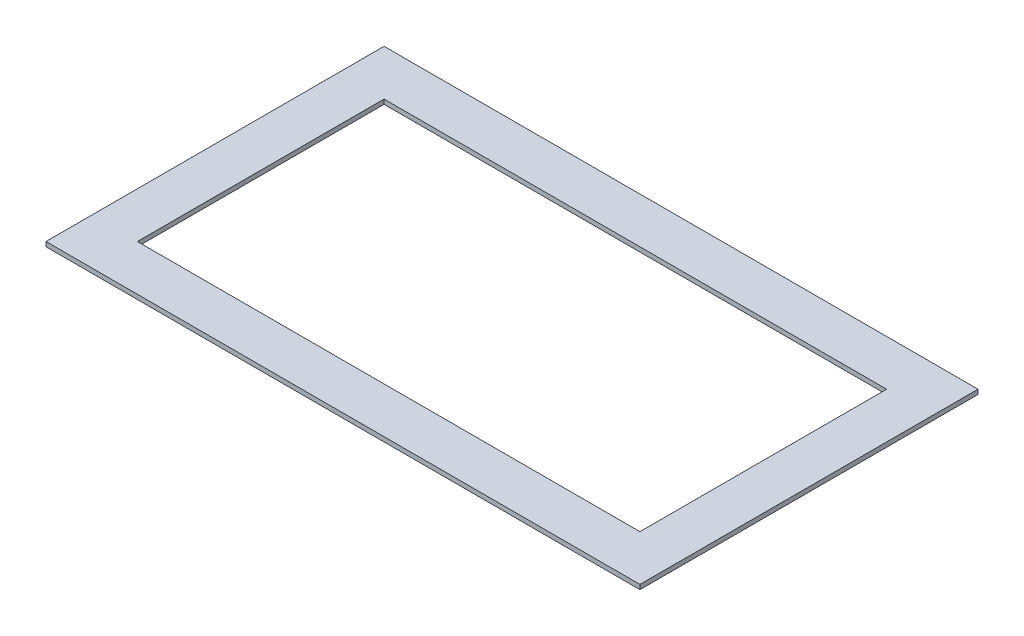
ISO-10303-21;
HEADER;
FILE_DESCRIPTION(('STEP AP214'),'2;1');
FILE_NAME('part.step','',(''),(''),'','','');
FILE_SCHEMA(('AUTOMOTIVE_DESIGN { 1 0 10303 214 1 1 1 1 }'));
ENDSEC;
DATA;
#1=APPLICATION_CONTEXT('core data for automotive mechanical design processes');
#2=APPLICATION_PROTOCOL_DEFINITION('international standard','automotive_design',2000,#1);
#3=PRODUCT_CONTEXT('',#1,'mechanical');
#4=PRODUCT('Part','Part','',(#3));
#5=PRODUCT_RELATED_PRODUCT_CATEGORY('part','',(#4));
#6=PRODUCT_DEFINITION_FORMATION('','',#4);
#7=PRODUCT_DEFINITION_CONTEXT('part definition',#1,'design');
#8=PRODUCT_DEFINITION('design','',#6,#7);
#9=PRODUCT_DEFINITION_SHAPE('','',#8);
#10=(LENGTH_UNIT() NAMED_UNIT(*) SI_UNIT(.MILLI.,.METRE.));
#11=(NAMED_UNIT(*) PLANE_ANGLE_UNIT() SI_UNIT($,.RADIAN.));
#12=(NAMED_UNIT(*) SI_UNIT($,.STERADIAN.) SOLID_ANGLE_UNIT());
#13=UNCERTAINTY_MEASURE_WITH_UNIT(LENGTH_MEASURE(1.E-05),#10,'distance_accuracy_value','');
#14=(GEOMETRIC_REPRESENTATION_CONTEXT(3) GLOBAL_UNCERTAINTY_ASSIGNED_CONTEXT((#13)) GLOBAL_UNIT_ASSIGNED_CONTEXT((#10,
#11,#12)) REPRESENTATION_CONTEXT('',''));
#15=CARTESIAN_POINT('',(0.,0.,0.));
#16=DIRECTION('',(0.,0.,1.));
#17=DIRECTION('',(1.,0.,0.));
#18=AXIS2_PLACEMENT_3D('',#15,#16,#17);
#19=CARTESIAN_POINT('',(0.,0.5,0.));
#20=DIRECTION('',(0.,1.,0.));
#21=DIRECTION('',(0.,0.,1.));
#22=AXIS2_PLACEMENT_3D('',#19,#20,#21);
#23=PLANE('',#22);
#24=DIRECTION('',(0.,0.,-1.));
#25=VECTOR('',#24,1.);
#26=CARTESIAN_POINT('',(32.5,0.5,-18.5));
#27=LINE('',#26,#25);
#28=CARTESIAN_POINT('',(32.5,0.5,18.5));
#29=VERTEX_POINT('',#28);
#30=CARTESIAN_POINT('',(32.5,0.5,-18.5));
#31=VERTEX_POINT('',#30);
#32=EDGE_CURVE('E136',#29,#31,#27,.T.);
#33=ORIENTED_EDGE('',*,*,#32,.T.);
#34=DIRECTION('',(-1.,0.,0.));
#35=VECTOR('',#34,1.);
#36=CARTESIAN_POINT('',(-32.5,0.5,-18.5));
#37=LINE('',#36,#35);
#38=CARTESIAN_POINT('',(-32.5,0.5,-18.5));
#39=VERTEX_POINT('',#38);
#40=EDGE_CURVE('E139',#31,#39,#37,.T.);
#41=ORIENTED_EDGE('',*,*,#40,.T.);
#42=DIRECTION('',(0.,0.,1.));
#43=VECTOR('',#42,1.);
#44=CARTESIAN_POINT('',(-32.5,0.5,-18.5));
#45=LINE('',#44,#43);
#46=CARTESIAN_POINT('',(-32.5,0.5,18.5));
#47=VERTEX_POINT('',#46);
#48=EDGE_CURVE('E142',#39,#47,#45,.T.);
#49=ORIENTED_EDGE('',*,*,#48,.T.);
#50=DIRECTION('',(1.,0.,0.));
#51=VECTOR('',#50,1.);
#52=CARTESIAN_POINT('',(-32.5,0.5,18.5));
#53=LINE('',#52,#51);
#54=EDGE_CURVE('E144',#47,#29,#53,.T.);
#55=ORIENTED_EDGE('',*,*,#54,.T.);
#56=EDGE_LOOP('',(#33,#41,#49,#55));
#57=FACE_BOUND('',#56,.T.);
#58=DIRECTION('',(1.,0.,0.));
#59=VECTOR('',#58,1.);
#60=CARTESIAN_POINT('',(-27.5,0.5,13.5));
#61=LINE('',#60,#59);
#62=CARTESIAN_POINT('',(-27.5,0.5,13.5));
#63=VERTEX_POINT('',#62);
#64=CARTESIAN_POINT('',(27.5,0.5,13.5));
#65=VERTEX_POINT('',#64);
#66=EDGE_CURVE('E108',#63,#65,#61,.T.);
#67=ORIENTED_EDGE('',*,*,#66,.F.);
#68=DIRECTION('',(0.,0.,1.));
#69=VECTOR('',#68,1.);
#70=CARTESIAN_POINT('',(-27.5,0.5,-13.5));
#71=LINE('',#70,#69);
#72=CARTESIAN_POINT('',(-27.5,0.5,-13.5));
#73=VERTEX_POINT('',#72);
#74=EDGE_CURVE('E100',#73,#63,#71,.T.);
#75=ORIENTED_EDGE('',*,*,#74,.F.);
#76=DIRECTION('',(-1.,0.,0.));
#77=VECTOR('',#76,1.);
#78=CARTESIAN_POINT('',(-27.5,0.5,-13.5));
#79=LINE('',#78,#77);
#80=CARTESIAN_POINT('',(27.5,0.5,-13.5));
#81=VERTEX_POINT('',#80);
#82=EDGE_CURVE('E122',#81,#73,#79,.T.);
#83=ORIENTED_EDGE('',*,*,#82,.F.);
#84=DIRECTION('',(0.,0.,-1.));
#85=VECTOR('',#84,1.);
#86=CARTESIAN_POINT('',(27.5,0.5,-13.5));
#87=LINE('',#86,#85);
#88=EDGE_CURVE('E120',#65,#81,#87,.T.);
#89=ORIENTED_EDGE('',*,*,#88,.F.);
#90=EDGE_LOOP('',(#67,#75,#83,#89));
#91=FACE_BOUND('',#90,.T.);
#92=ADVANCED_FACE('F35',(#57,#91),#23,.T.);
#93=CARTESIAN_POINT('',(0.,0.,0.));
#94=DIRECTION('',(0.,1.,0.));
#95=DIRECTION('',(0.,0.,1.));
#96=AXIS2_PLACEMENT_3D('',#93,#94,#95);
#97=PLANE('',#96);
#98=DIRECTION('',(0.,0.,-1.));
#99=VECTOR('',#98,1.);
#100=CARTESIAN_POINT('',(32.5,0.,-18.5));
#101=LINE('',#100,#99);
#102=CARTESIAN_POINT('',(32.5,0.,18.5));
#103=VERTEX_POINT('',#102);
#104=CARTESIAN_POINT('',(32.5,0.,-18.5));
#105=VERTEX_POINT('',#104);
#106=EDGE_CURVE('E116',#103,#105,#101,.T.);
#107=ORIENTED_EDGE('',*,*,#106,.F.);
#108=DIRECTION('',(1.,0.,0.));
#109=VECTOR('',#108,1.);
#110=CARTESIAN_POINT('',(-32.5,0.,18.5));
#111=LINE('',#110,#109);
#112=CARTESIAN_POINT('',(-32.5,0.,18.5));
#113=VERTEX_POINT('',#112);
#114=EDGE_CURVE('E140',#113,#103,#111,.T.);
#115=ORIENTED_EDGE('',*,*,#114,.F.);
#116=DIRECTION('',(0.,0.,1.));
#117=VECTOR('',#116,1.);
#118=CARTESIAN_POINT('',(-32.5,0.,-18.5));
#119=LINE('',#118,#117);
#120=CARTESIAN_POINT('',(-32.5,0.,-18.5));
#121=VERTEX_POINT('',#120);
#122=EDGE_CURVE('E151',#121,#113,#119,.T.);
#123=ORIENTED_EDGE('',*,*,#122,.F.);
#124=DIRECTION('',(-1.,0.,0.));
#125=VECTOR('',#124,1.);
#126=CARTESIAN_POINT('',(-32.5,0.,-18.5));
#127=LINE('',#126,#125);
#128=EDGE_CURVE('E149',#105,#121,#127,.T.);
#129=ORIENTED_EDGE('',*,*,#128,.F.);
#130=EDGE_LOOP('',(#107,#115,#123,#129));
#131=FACE_BOUND('',#130,.T.);
#132=DIRECTION('',(0.,0.,1.));
#133=VECTOR('',#132,1.);
#134=CARTESIAN_POINT('',(-27.5,0.,-13.5));
#135=LINE('',#134,#133);
#136=CARTESIAN_POINT('',(-27.5,0.,-13.5));
#137=VERTEX_POINT('',#136);
#138=CARTESIAN_POINT('',(-27.5,0.,13.5));
#139=VERTEX_POINT('',#138);
#140=EDGE_CURVE('E58',#137,#139,#135,.T.);
#141=ORIENTED_EDGE('',*,*,#140,.T.);
#142=DIRECTION('',(1.,0.,0.));
#143=VECTOR('',#142,1.);
#144=CARTESIAN_POINT('',(-27.5,0.,13.5));
#145=LINE('',#144,#143);
#146=CARTESIAN_POINT('',(27.5,0.,13.5));
#147=VERTEX_POINT('',#146);
#148=EDGE_CURVE('E115',#139,#147,#145,.T.);
#149=ORIENTED_EDGE('',*,*,#148,.T.);
#150=DIRECTION('',(0.,0.,-1.));
#151=VECTOR('',#150,1.);
#152=CARTESIAN_POINT('',(27.5,0.,-13.5));
#153=LINE('',#152,#151);
#154=CARTESIAN_POINT('',(27.5,0.,-13.5));
#155=VERTEX_POINT('',#154);
#156=EDGE_CURVE('E128',#147,#155,#153,.T.);
#157=ORIENTED_EDGE('',*,*,#156,.T.);
#158=DIRECTION('',(-1.,0.,0.));
#159=VECTOR('',#158,1.);
#160=CARTESIAN_POINT('',(-27.5,0.,-13.5));
#161=LINE('',#160,#159);
#162=EDGE_CURVE('E109',#155,#137,#161,.T.);
#163=ORIENTED_EDGE('',*,*,#162,.T.);
#164=EDGE_LOOP('',(#141,#149,#157,#163));
#165=FACE_BOUND('',#164,.T.);
#166=ADVANCED_FACE('F169',(#131,#165),#97,.F.);
#167=CARTESIAN_POINT('',(32.5,0.5,-18.5));
#168=DIRECTION('',(-1.,0.,0.));
#169=DIRECTION('',(0.,0.,1.));
#170=AXIS2_PLACEMENT_3D('',#167,#168,#169);
#171=PLANE('',#170);
#172=ORIENTED_EDGE('',*,*,#106,.T.);
#173=DIRECTION('',(0.,-1.,0.));
#174=VECTOR('',#173,1.);
#175=CARTESIAN_POINT('',(32.5,0.5,-18.5));
#176=LINE('',#175,#174);
#177=EDGE_CURVE('E11',#31,#105,#176,.T.);
#178=ORIENTED_EDGE('',*,*,#177,.F.);
#179=ORIENTED_EDGE('',*,*,#32,.F.);
#180=DIRECTION('',(0.,-1.,0.));
#181=VECTOR('',#180,1.);
#182=CARTESIAN_POINT('',(32.5,0.5,18.5));
#183=LINE('',#182,#181);
#184=EDGE_CURVE('E146',#29,#103,#183,.T.);
#185=ORIENTED_EDGE('',*,*,#184,.T.);
#186=EDGE_LOOP('',(#172,#178,#179,#185));
#187=FACE_BOUND('',#186,.T.);
#188=ADVANCED_FACE('F37',(#187),#171,.F.);
#189=CARTESIAN_POINT('',(-32.5,0.5,-18.5));
#190=DIRECTION('',(0.,0.,1.));
#191=DIRECTION('',(1.,0.,0.));
#192=AXIS2_PLACEMENT_3D('',#189,#190,#191);
#193=PLANE('',#192);
#194=ORIENTED_EDGE('',*,*,#128,.T.);
#195=DIRECTION('',(0.,-1.,0.));
#196=VECTOR('',#195,1.);
#197=CARTESIAN_POINT('',(-32.5,0.5,-18.5));
#198=LINE('',#197,#196);
#199=EDGE_CURVE('E43',#39,#121,#198,.T.);
#200=ORIENTED_EDGE('',*,*,#199,.F.);
#201=ORIENTED_EDGE('',*,*,#40,.F.);
#202=ORIENTED_EDGE('',*,*,#177,.T.);
#203=EDGE_LOOP('',(#194,#200,#201,#202));
#204=FACE_BOUND('',#203,.T.);
#205=ADVANCED_FACE('F179',(#204),#193,.F.);
#206=CARTESIAN_POINT('',(-32.5,0.5,-18.5));
#207=DIRECTION('',(1.,0.,0.));
#208=DIRECTION('',(0.,0.,-1.));
#209=AXIS2_PLACEMENT_3D('',#206,#207,#208);
#210=PLANE('',#209);
#211=ORIENTED_EDGE('',*,*,#122,.T.);
#212=DIRECTION('',(0.,-1.,0.));
#213=VECTOR('',#212,1.);
#214=CARTESIAN_POINT('',(-32.5,0.5,18.5));
#215=LINE('',#214,#213);
#216=EDGE_CURVE('E156',#47,#113,#215,.T.);
#217=ORIENTED_EDGE('',*,*,#216,.F.);
#218=ORIENTED_EDGE('',*,*,#48,.F.);
#219=ORIENTED_EDGE('',*,*,#199,.T.);
#220=EDGE_LOOP('',(#211,#217,#218,#219));
#221=FACE_BOUND('',#220,.T.);
#222=ADVANCED_FACE('F163',(#221),#210,.F.);
#223=CARTESIAN_POINT('',(-32.5,0.5,18.5));
#224=DIRECTION('',(0.,0.,-1.));
#225=DIRECTION('',(-1.,0.,0.));
#226=AXIS2_PLACEMENT_3D('',#223,#224,#225);
#227=PLANE('',#226);
#228=ORIENTED_EDGE('',*,*,#114,.T.);
#229=ORIENTED_EDGE('',*,*,#184,.F.);
#230=ORIENTED_EDGE('',*,*,#54,.F.);
#231=ORIENTED_EDGE('',*,*,#216,.T.);
#232=EDGE_LOOP('',(#228,#229,#230,#231));
#233=FACE_BOUND('',#232,.T.);
#234=ADVANCED_FACE('F173',(#233),#227,.F.);
#235=CARTESIAN_POINT('',(-27.5,0.5,-13.5));
#236=DIRECTION('',(1.,0.,0.));
#237=DIRECTION('',(0.,0.,-1.));
#238=AXIS2_PLACEMENT_3D('',#235,#236,#237);
#239=PLANE('',#238);
#240=ORIENTED_EDGE('',*,*,#140,.F.);
#241=DIRECTION('',(0.,-1.,0.));
#242=VECTOR('',#241,1.);
#243=CARTESIAN_POINT('',(-27.5,0.5,-13.5));
#244=LINE('',#243,#242);
#245=EDGE_CURVE('E104',#73,#137,#244,.T.);
#246=ORIENTED_EDGE('',*,*,#245,.F.);
#247=ORIENTED_EDGE('',*,*,#74,.T.);
#248=DIRECTION('',(0.,-1.,0.));
#249=VECTOR('',#248,1.);
#250=CARTESIAN_POINT('',(-27.5,0.5,13.5));
#251=LINE('',#250,#249);
#252=EDGE_CURVE('E103',#63,#139,#251,.T.);
#253=ORIENTED_EDGE('',*,*,#252,.T.);
#254=EDGE_LOOP('',(#240,#246,#247,#253));
#255=FACE_BOUND('',#254,.T.);
#256=ADVANCED_FACE('F102',(#255),#239,.T.);
#257=CARTESIAN_POINT('',(-27.5,0.5,13.5));
#258=DIRECTION('',(0.,0.,-1.));
#259=DIRECTION('',(-1.,0.,0.));
#260=AXIS2_PLACEMENT_3D('',#257,#258,#259);
#261=PLANE('',#260);
#262=ORIENTED_EDGE('',*,*,#148,.F.);
#263=ORIENTED_EDGE('',*,*,#252,.F.);
#264=ORIENTED_EDGE('',*,*,#66,.T.);
#265=DIRECTION('',(0.,-1.,0.));
#266=VECTOR('',#265,1.);
#267=CARTESIAN_POINT('',(27.5,0.5,13.5));
#268=LINE('',#267,#266);
#269=EDGE_CURVE('E117',#65,#147,#268,.T.);
#270=ORIENTED_EDGE('',*,*,#269,.T.);
#271=EDGE_LOOP('',(#262,#263,#264,#270));
#272=FACE_BOUND('',#271,.T.);
#273=ADVANCED_FACE('F112',(#272),#261,.T.);
#274=CARTESIAN_POINT('',(27.5,0.5,-13.5));
#275=DIRECTION('',(-1.,0.,0.));
#276=DIRECTION('',(0.,0.,1.));
#277=AXIS2_PLACEMENT_3D('',#274,#275,#276);
#278=PLANE('',#277);
#279=ORIENTED_EDGE('',*,*,#156,.F.);
#280=ORIENTED_EDGE('',*,*,#269,.F.);
#281=ORIENTED_EDGE('',*,*,#88,.T.);
#282=DIRECTION('',(0.,-1.,0.));
#283=VECTOR('',#282,1.);
#284=CARTESIAN_POINT('',(27.5,0.5,-13.5));
#285=LINE('',#284,#283);
#286=EDGE_CURVE('E50',#81,#155,#285,.T.);
#287=ORIENTED_EDGE('',*,*,#286,.T.);
#288=EDGE_LOOP('',(#279,#280,#281,#287));
#289=FACE_BOUND('',#288,.T.);
#290=ADVANCED_FACE('F202',(#289),#278,.T.);
#291=CARTESIAN_POINT('',(-27.5,0.5,-13.5));
#292=DIRECTION('',(0.,0.,1.));
#293=DIRECTION('',(1.,0.,0.));
#294=AXIS2_PLACEMENT_3D('',#291,#292,#293);
#295=PLANE('',#294);
#296=ORIENTED_EDGE('',*,*,#162,.F.);
#297=ORIENTED_EDGE('',*,*,#286,.F.);
#298=ORIENTED_EDGE('',*,*,#82,.T.);
#299=ORIENTED_EDGE('',*,*,#245,.T.);
#300=EDGE_LOOP('',(#296,#297,#298,#299));
#301=FACE_BOUND('',#300,.T.);
#302=ADVANCED_FACE('F206',(#301),#295,.T.);
#303=CLOSED_SHELL('',(#92,#166,#188,#205,#222,#234,#256,#273,#290,#302));
#304=MANIFOLD_SOLID_BREP('B2',#303);
#305=ADVANCED_BREP_SHAPE_REPRESENTATION('',(#18,#304),#14);
#306=SHAPE_DEFINITION_REPRESENTATION(#9,#305);
ENDSEC;
END-ISO-10303-21;
